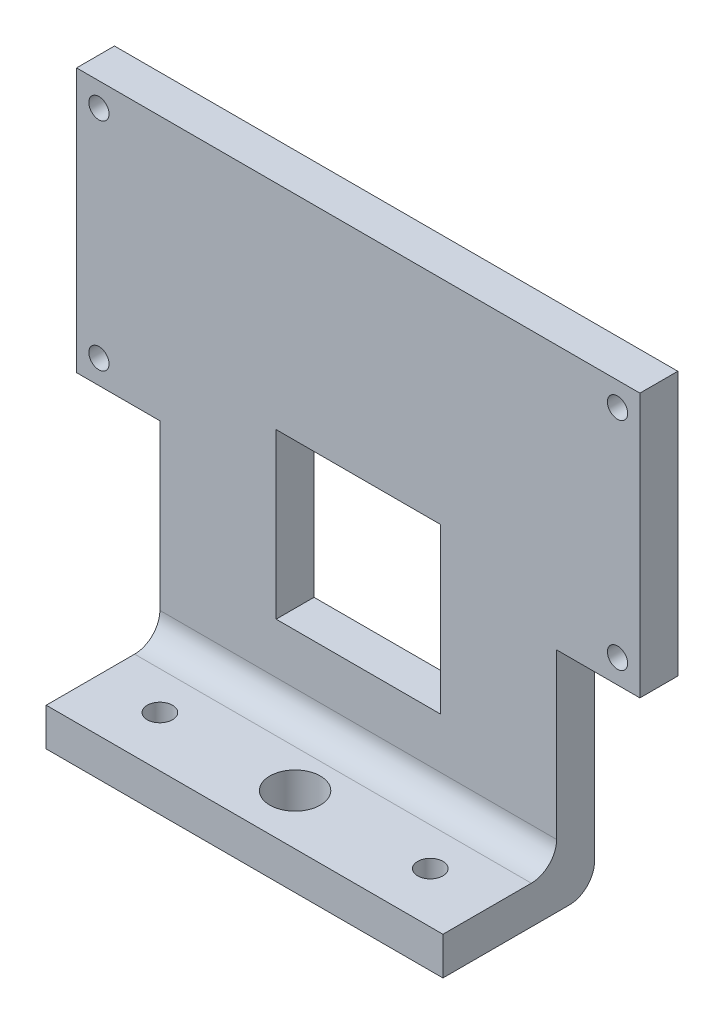
ISO-10303-21;
HEADER;
FILE_DESCRIPTION(('STEP AP214'),'2;1');
FILE_NAME('part.step','',(''),(''),'','','');
FILE_SCHEMA(('AUTOMOTIVE_DESIGN { 1 0 10303 214 1 1 1 1 }'));
ENDSEC;
DATA;
#1=APPLICATION_CONTEXT('core data for automotive mechanical design processes');
#2=APPLICATION_PROTOCOL_DEFINITION('international standard','automotive_design',2000,#1);
#3=PRODUCT_CONTEXT('',#1,'mechanical');
#4=PRODUCT('Part','Part','',(#3));
#5=PRODUCT_RELATED_PRODUCT_CATEGORY('part','',(#4));
#6=PRODUCT_DEFINITION_FORMATION('','',#4);
#7=PRODUCT_DEFINITION_CONTEXT('part definition',#1,'design');
#8=PRODUCT_DEFINITION('design','',#6,#7);
#9=PRODUCT_DEFINITION_SHAPE('','',#8);
#10=(LENGTH_UNIT() NAMED_UNIT(*) SI_UNIT(.MILLI.,.METRE.));
#11=(NAMED_UNIT(*) PLANE_ANGLE_UNIT() SI_UNIT($,.RADIAN.));
#12=(NAMED_UNIT(*) SI_UNIT($,.STERADIAN.) SOLID_ANGLE_UNIT());
#13=UNCERTAINTY_MEASURE_WITH_UNIT(LENGTH_MEASURE(1.E-05),#10,'distance_accuracy_value','');
#14=(GEOMETRIC_REPRESENTATION_CONTEXT(3) GLOBAL_UNCERTAINTY_ASSIGNED_CONTEXT((#13)) GLOBAL_UNIT_ASSIGNED_CONTEXT((#10,
#11,#12)) REPRESENTATION_CONTEXT('',''));
#15=CARTESIAN_POINT('',(0.,0.,0.));
#16=DIRECTION('',(0.,0.,1.));
#17=DIRECTION('',(1.,0.,0.));
#18=AXIS2_PLACEMENT_3D('',#15,#16,#17);
#19=CARTESIAN_POINT('',(0.,3.,1.));
#20=DIRECTION('',(0.,1.,0.));
#21=DIRECTION('',(0.,0.,1.));
#22=AXIS2_PLACEMENT_3D('',#19,#20,#21);
#23=PLANE('',#22);
#24=CARTESIAN_POINT('',(0.,3.,1.));
#25=DIRECTION('',(0.,-1.,0.));
#26=DIRECTION('',(0.,0.,1.));
#27=AXIS2_PLACEMENT_3D('',#24,#25,#26);
#28=CIRCLE('',#27,2.);
#29=CARTESIAN_POINT('',(0.,3.,3.));
#30=VERTEX_POINT('',#29);
#31=EDGE_CURVE('E266',#30,#30,#28,.T.);
#32=ORIENTED_EDGE('',*,*,#31,.T.);
#33=EDGE_LOOP('',(#32));
#34=FACE_BOUND('',#33,.T.);
#35=CARTESIAN_POINT('',(-10.705,3.,1.));
#36=DIRECTION('',(0.,1.,0.));
#37=DIRECTION('',(0.,0.,1.));
#38=AXIS2_PLACEMENT_3D('',#35,#36,#37);
#39=CIRCLE('',#38,1.);
#40=CARTESIAN_POINT('',(-10.705,3.,2.));
#41=VERTEX_POINT('',#40);
#42=EDGE_CURVE('E254',#41,#41,#39,.T.);
#43=ORIENTED_EDGE('',*,*,#42,.F.);
#44=EDGE_LOOP('',(#43));
#45=FACE_BOUND('',#44,.T.);
#46=CARTESIAN_POINT('',(10.705,3.,1.));
#47=DIRECTION('',(0.,-1.,0.));
#48=DIRECTION('',(0.,0.,1.));
#49=AXIS2_PLACEMENT_3D('',#46,#47,#48);
#50=CIRCLE('',#49,1.);
#51=CARTESIAN_POINT('',(10.705,3.,2.));
#52=VERTEX_POINT('',#51);
#53=EDGE_CURVE('E187',#52,#52,#50,.T.);
#54=ORIENTED_EDGE('',*,*,#53,.T.);
#55=EDGE_LOOP('',(#54));
#56=FACE_BOUND('',#55,.T.);
#57=DIRECTION('',(0.,0.,1.));
#58=VECTOR('',#57,1.);
#59=CARTESIAN_POINT('',(15.705,3.,-7.));
#60=LINE('',#59,#58);
#61=CARTESIAN_POINT('',(15.705,3.,-2.));
#62=VERTEX_POINT('',#61);
#63=CARTESIAN_POINT('',(15.705,3.,5.));
#64=VERTEX_POINT('',#63);
#65=EDGE_CURVE('E195',#62,#64,#60,.T.);
#66=ORIENTED_EDGE('',*,*,#65,.F.);
#67=DIRECTION('',(-1.,0.,0.));
#68=VECTOR('',#67,1.);
#69=CARTESIAN_POINT('',(0.,3.,-2.));
#70=LINE('',#69,#68);
#71=CARTESIAN_POINT('',(-15.705,3.,-2.));
#72=VERTEX_POINT('',#71);
#73=EDGE_CURVE('E290',#62,#72,#70,.T.);
#74=ORIENTED_EDGE('',*,*,#73,.T.);
#75=DIRECTION('',(0.,0.,1.));
#76=VECTOR('',#75,1.);
#77=CARTESIAN_POINT('',(-15.705,3.,-7.));
#78=LINE('',#77,#76);
#79=CARTESIAN_POINT('',(-15.705,3.,5.));
#80=VERTEX_POINT('',#79);
#81=EDGE_CURVE('E260',#72,#80,#78,.T.);
#82=ORIENTED_EDGE('',*,*,#81,.T.);
#83=DIRECTION('',(1.,0.,0.));
#84=VECTOR('',#83,1.);
#85=CARTESIAN_POINT('',(0.,3.,5.));
#86=LINE('',#85,#84);
#87=EDGE_CURVE('E262',#80,#64,#86,.T.);
#88=ORIENTED_EDGE('',*,*,#87,.T.);
#89=EDGE_LOOP('',(#66,#74,#82,#88));
#90=FACE_BOUND('',#89,.T.);
#91=ADVANCED_FACE('F37',(#34,#45,#56,#90),#23,.T.);
#92=CARTESIAN_POINT('',(0.,0.,1.));
#93=DIRECTION('',(0.,1.,0.));
#94=DIRECTION('',(0.,0.,1.));
#95=AXIS2_PLACEMENT_3D('',#92,#93,#94);
#96=PLANE('',#95);
#97=CARTESIAN_POINT('',(0.,0.,1.));
#98=DIRECTION('',(0.,-1.,0.));
#99=DIRECTION('',(0.,0.,1.));
#100=AXIS2_PLACEMENT_3D('',#97,#98,#99);
#101=CIRCLE('',#100,2.);
#102=CARTESIAN_POINT('',(0.,0.,3.));
#103=VERTEX_POINT('',#102);
#104=EDGE_CURVE('E263',#103,#103,#101,.T.);
#105=ORIENTED_EDGE('',*,*,#104,.F.);
#106=EDGE_LOOP('',(#105));
#107=FACE_BOUND('',#106,.T.);
#108=DIRECTION('',(0.,0.,1.));
#109=VECTOR('',#108,1.);
#110=CARTESIAN_POINT('',(-15.705,0.,-7.));
#111=LINE('',#110,#109);
#112=CARTESIAN_POINT('',(-15.705,0.,-5.));
#113=VERTEX_POINT('',#112);
#114=CARTESIAN_POINT('',(-15.705,0.,5.));
#115=VERTEX_POINT('',#114);
#116=EDGE_CURVE('E257',#113,#115,#111,.T.);
#117=ORIENTED_EDGE('',*,*,#116,.F.);
#118=DIRECTION('',(-1.,0.,0.));
#119=VECTOR('',#118,1.);
#120=CARTESIAN_POINT('',(0.,0.,-5.));
#121=LINE('',#120,#119);
#122=CARTESIAN_POINT('',(15.705,0.,-5.));
#123=VERTEX_POINT('',#122);
#124=EDGE_CURVE('E286',#113,#123,#121,.F.);
#125=ORIENTED_EDGE('',*,*,#124,.T.);
#126=DIRECTION('',(0.,0.,1.));
#127=VECTOR('',#126,1.);
#128=CARTESIAN_POINT('',(15.705,0.,-7.));
#129=LINE('',#128,#127);
#130=CARTESIAN_POINT('',(15.705,0.,5.));
#131=VERTEX_POINT('',#130);
#132=EDGE_CURVE('E190',#123,#131,#129,.T.);
#133=ORIENTED_EDGE('',*,*,#132,.T.);
#134=DIRECTION('',(1.,0.,0.));
#135=VECTOR('',#134,1.);
#136=CARTESIAN_POINT('',(0.,0.,5.));
#137=LINE('',#136,#135);
#138=EDGE_CURVE('E271',#115,#131,#137,.T.);
#139=ORIENTED_EDGE('',*,*,#138,.F.);
#140=EDGE_LOOP('',(#117,#125,#133,#139));
#141=FACE_BOUND('',#140,.T.);
#142=CARTESIAN_POINT('',(-10.705,0.,1.));
#143=DIRECTION('',(0.,1.,0.));
#144=DIRECTION('',(0.,0.,1.));
#145=AXIS2_PLACEMENT_3D('',#142,#143,#144);
#146=CIRCLE('',#145,1.);
#147=CARTESIAN_POINT('',(-10.705,0.,2.));
#148=VERTEX_POINT('',#147);
#149=EDGE_CURVE('E245',#148,#148,#146,.T.);
#150=ORIENTED_EDGE('',*,*,#149,.T.);
#151=EDGE_LOOP('',(#150));
#152=FACE_BOUND('',#151,.T.);
#153=CARTESIAN_POINT('',(10.705,0.,1.));
#154=DIRECTION('',(0.,-1.,0.));
#155=DIRECTION('',(0.,0.,1.));
#156=AXIS2_PLACEMENT_3D('',#153,#154,#155);
#157=CIRCLE('',#156,1.);
#158=CARTESIAN_POINT('',(10.705,0.,2.));
#159=VERTEX_POINT('',#158);
#160=EDGE_CURVE('E191',#159,#159,#157,.T.);
#161=ORIENTED_EDGE('',*,*,#160,.F.);
#162=EDGE_LOOP('',(#161));
#163=FACE_BOUND('',#162,.T.);
#164=ADVANCED_FACE('F314',(#107,#141,#152,#163),#96,.F.);
#165=CARTESIAN_POINT('',(0.,3.,-7.));
#166=DIRECTION('',(0.,0.,1.));
#167=DIRECTION('',(1.,0.,0.));
#168=AXIS2_PLACEMENT_3D('',#165,#166,#167);
#169=PLANE('',#168);
#170=DIRECTION('',(0.,-1.,0.));
#171=VECTOR('',#170,1.);
#172=CARTESIAN_POINT('',(15.705,3.,-7.));
#173=LINE('',#172,#171);
#174=CARTESIAN_POINT('',(15.705,18.,-7.));
#175=VERTEX_POINT('',#174);
#176=CARTESIAN_POINT('',(15.705,2.,-7.));
#177=VERTEX_POINT('',#176);
#178=EDGE_CURVE('E197',#175,#177,#173,.T.);
#179=ORIENTED_EDGE('',*,*,#178,.T.);
#180=DIRECTION('',(-1.,0.,0.));
#181=VECTOR('',#180,1.);
#182=CARTESIAN_POINT('',(0.,2.,-7.));
#183=LINE('',#182,#181);
#184=CARTESIAN_POINT('',(-15.705,2.,-7.));
#185=VERTEX_POINT('',#184);
#186=EDGE_CURVE('E281',#177,#185,#183,.T.);
#187=ORIENTED_EDGE('',*,*,#186,.T.);
#188=DIRECTION('',(0.,-1.,0.));
#189=VECTOR('',#188,1.);
#190=CARTESIAN_POINT('',(-15.705,3.,-7.));
#191=LINE('',#190,#189);
#192=CARTESIAN_POINT('',(-15.705,18.,-7.));
#193=VERTEX_POINT('',#192);
#194=EDGE_CURVE('E278',#193,#185,#191,.T.);
#195=ORIENTED_EDGE('',*,*,#194,.F.);
#196=DIRECTION('',(-1.,0.,0.));
#197=VECTOR('',#196,1.);
#198=CARTESIAN_POINT('',(-15.705,18.,-7.));
#199=LINE('',#198,#197);
#200=CARTESIAN_POINT('',(-22.3,18.,-6.99999999999999));
#201=VERTEX_POINT('',#200);
#202=EDGE_CURVE('E214',#193,#201,#199,.T.);
#203=ORIENTED_EDGE('',*,*,#202,.T.);
#204=DIRECTION('',(0.,1.,0.));
#205=VECTOR('',#204,1.);
#206=CARTESIAN_POINT('',(-22.3,18.,-6.99999999999999));
#207=LINE('',#206,#205);
#208=CARTESIAN_POINT('',(-22.3,38.9,-6.99999999999999));
#209=VERTEX_POINT('',#208);
#210=EDGE_CURVE('E232',#201,#209,#207,.T.);
#211=ORIENTED_EDGE('',*,*,#210,.T.);
#212=DIRECTION('',(1.,0.,0.));
#213=VECTOR('',#212,1.);
#214=CARTESIAN_POINT('',(-22.3,38.9,-6.99999999999999));
#215=LINE('',#214,#213);
#216=CARTESIAN_POINT('',(22.3,38.9,-6.99999999999999));
#217=VERTEX_POINT('',#216);
#218=EDGE_CURVE('E235',#209,#217,#215,.T.);
#219=ORIENTED_EDGE('',*,*,#218,.T.);
#220=DIRECTION('',(0.,1.,0.));
#221=VECTOR('',#220,1.);
#222=CARTESIAN_POINT('',(22.3,18.,-6.99999999999999));
#223=LINE('',#222,#221);
#224=CARTESIAN_POINT('',(22.3,18.,-6.99999999999999));
#225=VERTEX_POINT('',#224);
#226=EDGE_CURVE('E328',#225,#217,#223,.T.);
#227=ORIENTED_EDGE('',*,*,#226,.F.);
#228=DIRECTION('',(1.,0.,0.));
#229=VECTOR('',#228,1.);
#230=CARTESIAN_POINT('',(15.705,18.,-7.));
#231=LINE('',#230,#229);
#232=EDGE_CURVE('E172',#175,#225,#231,.T.);
#233=ORIENTED_EDGE('',*,*,#232,.F.);
#234=EDGE_LOOP('',(#179,#187,#195,#203,#211,#219,#227,#233));
#235=FACE_BOUND('',#234,.T.);
#236=DIRECTION('',(1.,0.,0.));
#237=VECTOR('',#236,1.);
#238=CARTESIAN_POINT('',(0.,9.,-7.));
#239=LINE('',#238,#237);
#240=CARTESIAN_POINT('',(-6.5,9.,-7.));
#241=VERTEX_POINT('',#240);
#242=CARTESIAN_POINT('',(6.5,9.,-7.));
#243=VERTEX_POINT('',#242);
#244=EDGE_CURVE('E220',#241,#243,#239,.T.);
#245=ORIENTED_EDGE('',*,*,#244,.T.);
#246=DIRECTION('',(0.,-1.,0.));
#247=VECTOR('',#246,1.);
#248=CARTESIAN_POINT('',(6.5,9.,-7.));
#249=LINE('',#248,#247);
#250=CARTESIAN_POINT('',(6.5,22.,-7.));
#251=VERTEX_POINT('',#250);
#252=EDGE_CURVE('E177',#251,#243,#249,.T.);
#253=ORIENTED_EDGE('',*,*,#252,.F.);
#254=DIRECTION('',(-1.,0.,0.));
#255=VECTOR('',#254,1.);
#256=CARTESIAN_POINT('',(-6.5,22.,-7.));
#257=LINE('',#256,#255);
#258=CARTESIAN_POINT('',(-6.5,22.,-7.));
#259=VERTEX_POINT('',#258);
#260=EDGE_CURVE('E237',#251,#259,#257,.T.);
#261=ORIENTED_EDGE('',*,*,#260,.T.);
#262=DIRECTION('',(0.,-1.,0.));
#263=VECTOR('',#262,1.);
#264=CARTESIAN_POINT('',(-6.5,9.,-7.));
#265=LINE('',#264,#263);
#266=EDGE_CURVE('E240',#259,#241,#265,.T.);
#267=ORIENTED_EDGE('',*,*,#266,.T.);
#268=EDGE_LOOP('',(#245,#253,#261,#267));
#269=FACE_BOUND('',#268,.T.);
#270=CARTESIAN_POINT('',(-20.53,37.02,-7.));
#271=DIRECTION('',(0.,0.,-1.));
#272=DIRECTION('',(1.,0.,0.));
#273=AXIS2_PLACEMENT_3D('',#270,#271,#272);
#274=CIRCLE('',#273,0.8);
#275=CARTESIAN_POINT('',(-19.73,37.02,-7.));
#276=VERTEX_POINT('',#275);
#277=EDGE_CURVE('E204',#276,#276,#274,.T.);
#278=ORIENTED_EDGE('',*,*,#277,.F.);
#279=EDGE_LOOP('',(#278));
#280=FACE_BOUND('',#279,.T.);
#281=CARTESIAN_POINT('',(-20.53,19.88,-7.));
#282=DIRECTION('',(0.,0.,-1.));
#283=DIRECTION('',(-1.,0.,0.));
#284=AXIS2_PLACEMENT_3D('',#281,#282,#283);
#285=CIRCLE('',#284,0.799999999999999);
#286=CARTESIAN_POINT('',(-21.33,19.88,-7.));
#287=VERTEX_POINT('',#286);
#288=EDGE_CURVE('E208',#287,#287,#285,.T.);
#289=ORIENTED_EDGE('',*,*,#288,.F.);
#290=EDGE_LOOP('',(#289));
#291=FACE_BOUND('',#290,.T.);
#292=CARTESIAN_POINT('',(20.53,19.88,-7.));
#293=DIRECTION('',(0.,0.,1.));
#294=DIRECTION('',(1.,0.,0.));
#295=AXIS2_PLACEMENT_3D('',#292,#293,#294);
#296=CIRCLE('',#295,0.799999999999999);
#297=CARTESIAN_POINT('',(21.33,19.88,-7.));
#298=VERTEX_POINT('',#297);
#299=EDGE_CURVE('E354',#298,#298,#296,.T.);
#300=ORIENTED_EDGE('',*,*,#299,.T.);
#301=EDGE_LOOP('',(#300));
#302=FACE_BOUND('',#301,.T.);
#303=CARTESIAN_POINT('',(20.53,37.02,-7.));
#304=DIRECTION('',(0.,0.,1.));
#305=DIRECTION('',(-1.,0.,0.));
#306=AXIS2_PLACEMENT_3D('',#303,#304,#305);
#307=CIRCLE('',#306,0.8);
#308=CARTESIAN_POINT('',(19.73,37.02,-7.));
#309=VERTEX_POINT('',#308);
#310=EDGE_CURVE('E362',#309,#309,#307,.T.);
#311=ORIENTED_EDGE('',*,*,#310,.T.);
#312=EDGE_LOOP('',(#311));
#313=FACE_BOUND('',#312,.T.);
#314=ADVANCED_FACE('F324',(#235,#269,#280,#291,#302,#313),#169,.F.);
#315=CARTESIAN_POINT('',(-15.705,3.,-7.));
#316=DIRECTION('',(1.,0.,0.));
#317=DIRECTION('',(0.,0.,-1.));
#318=AXIS2_PLACEMENT_3D('',#315,#316,#317);
#319=PLANE('',#318);
#320=ORIENTED_EDGE('',*,*,#194,.T.);
#321=CARTESIAN_POINT('',(-15.705,2.,-5.));
#322=DIRECTION('',(1.,0.,0.));
#323=DIRECTION('',(0.,0.,-1.));
#324=AXIS2_PLACEMENT_3D('',#321,#322,#323);
#325=CIRCLE('',#324,2.);
#326=EDGE_CURVE('E284',#185,#113,#325,.F.);
#327=ORIENTED_EDGE('',*,*,#326,.T.);
#328=ORIENTED_EDGE('',*,*,#116,.T.);
#329=DIRECTION('',(0.,-1.,0.));
#330=VECTOR('',#329,1.);
#331=CARTESIAN_POINT('',(-15.705,3.,5.));
#332=LINE('',#331,#330);
#333=EDGE_CURVE('E269',#80,#115,#332,.T.);
#334=ORIENTED_EDGE('',*,*,#333,.F.);
#335=ORIENTED_EDGE('',*,*,#81,.F.);
#336=CARTESIAN_POINT('',(-15.705,5.,-2.));
#337=DIRECTION('',(1.,0.,0.));
#338=DIRECTION('',(0.,0.,-1.));
#339=AXIS2_PLACEMENT_3D('',#336,#337,#338);
#340=CIRCLE('',#339,2.);
#341=CARTESIAN_POINT('',(-15.705,5.,-4.));
#342=VERTEX_POINT('',#341);
#343=EDGE_CURVE('E45',#72,#342,#340,.T.);
#344=ORIENTED_EDGE('',*,*,#343,.T.);
#345=DIRECTION('',(0.,1.,0.));
#346=VECTOR('',#345,1.);
#347=CARTESIAN_POINT('',(-15.705,3.,-4.));
#348=LINE('',#347,#346);
#349=CARTESIAN_POINT('',(-15.705,18.,-4.));
#350=VERTEX_POINT('',#349);
#351=EDGE_CURVE('E217',#342,#350,#348,.T.);
#352=ORIENTED_EDGE('',*,*,#351,.T.);
#353=DIRECTION('',(0.,0.,-1.));
#354=VECTOR('',#353,1.);
#355=CARTESIAN_POINT('',(-15.705,18.,-4.));
#356=LINE('',#355,#354);
#357=EDGE_CURVE('E159',#350,#193,#356,.T.);
#358=ORIENTED_EDGE('',*,*,#357,.T.);
#359=EDGE_LOOP('',(#320,#327,#328,#334,#335,#344,#352,#358));
#360=FACE_BOUND('',#359,.T.);
#361=ADVANCED_FACE('F295',(#360),#319,.F.);
#362=CARTESIAN_POINT('',(0.,3.,5.));
#363=DIRECTION('',(0.,0.,-1.));
#364=DIRECTION('',(-1.,0.,0.));
#365=AXIS2_PLACEMENT_3D('',#362,#363,#364);
#366=PLANE('',#365);
#367=ORIENTED_EDGE('',*,*,#138,.T.);
#368=DIRECTION('',(0.,-1.,0.));
#369=VECTOR('',#368,1.);
#370=CARTESIAN_POINT('',(15.705,3.,5.));
#371=LINE('',#370,#369);
#372=EDGE_CURVE('E201',#64,#131,#371,.T.);
#373=ORIENTED_EDGE('',*,*,#372,.F.);
#374=ORIENTED_EDGE('',*,*,#87,.F.);
#375=ORIENTED_EDGE('',*,*,#333,.T.);
#376=EDGE_LOOP('',(#367,#373,#374,#375));
#377=FACE_BOUND('',#376,.T.);
#378=ADVANCED_FACE('F310',(#377),#366,.F.);
#379=CARTESIAN_POINT('',(0.,3.,1.));
#380=DIRECTION('',(0.,-1.,0.));
#381=DIRECTION('',(0.,0.,-1.));
#382=AXIS2_PLACEMENT_3D('',#379,#380,#381);
#383=CYLINDRICAL_SURFACE('',#382,2.);
#384=ORIENTED_EDGE('',*,*,#104,.T.);
#385=EDGE_LOOP('',(#384));
#386=FACE_BOUND('',#385,.T.);
#387=ORIENTED_EDGE('',*,*,#31,.F.);
#388=EDGE_LOOP('',(#387));
#389=FACE_BOUND('',#388,.T.);
#390=ADVANCED_FACE('F398',(#386,#389),#383,.F.);
#391=CARTESIAN_POINT('',(-10.705,3.,1.));
#392=DIRECTION('',(0.,-1.,0.));
#393=DIRECTION('',(0.,0.,-1.));
#394=AXIS2_PLACEMENT_3D('',#391,#392,#393);
#395=CYLINDRICAL_SURFACE('',#394,1.);
#396=ORIENTED_EDGE('',*,*,#42,.T.);
#397=EDGE_LOOP('',(#396));
#398=FACE_BOUND('',#397,.T.);
#399=ORIENTED_EDGE('',*,*,#149,.F.);
#400=EDGE_LOOP('',(#399));
#401=FACE_BOUND('',#400,.T.);
#402=ADVANCED_FACE('F396',(#398,#401),#395,.F.);
#403=CARTESIAN_POINT('',(0.,9.,-4.));
#404=DIRECTION('',(0.,1.,0.));
#405=DIRECTION('',(0.,0.,1.));
#406=AXIS2_PLACEMENT_3D('',#403,#404,#405);
#407=PLANE('',#406);
#408=ORIENTED_EDGE('',*,*,#244,.F.);
#409=DIRECTION('',(0.,0.,-1.));
#410=VECTOR('',#409,1.);
#411=CARTESIAN_POINT('',(-6.5,9.,-4.));
#412=LINE('',#411,#410);
#413=CARTESIAN_POINT('',(-6.5,9.,-4.));
#414=VERTEX_POINT('',#413);
#415=EDGE_CURVE('E155',#414,#241,#412,.T.);
#416=ORIENTED_EDGE('',*,*,#415,.F.);
#417=DIRECTION('',(1.,0.,0.));
#418=VECTOR('',#417,1.);
#419=CARTESIAN_POINT('',(0.,9.,-4.));
#420=LINE('',#419,#418);
#421=CARTESIAN_POINT('',(6.5,9.,-4.));
#422=VERTEX_POINT('',#421);
#423=EDGE_CURVE('E149',#414,#422,#420,.T.);
#424=ORIENTED_EDGE('',*,*,#423,.T.);
#425=DIRECTION('',(0.,0.,-1.));
#426=VECTOR('',#425,1.);
#427=CARTESIAN_POINT('',(6.5,9.,-4.));
#428=LINE('',#427,#426);
#429=EDGE_CURVE('E154',#422,#243,#428,.T.);
#430=ORIENTED_EDGE('',*,*,#429,.T.);
#431=EDGE_LOOP('',(#408,#416,#424,#430));
#432=FACE_BOUND('',#431,.T.);
#433=ADVANCED_FACE('F152',(#432),#407,.T.);
#434=CARTESIAN_POINT('',(-6.5,9.,-4.));
#435=DIRECTION('',(1.,0.,0.));
#436=DIRECTION('',(0.,0.,-1.));
#437=AXIS2_PLACEMENT_3D('',#434,#435,#436);
#438=PLANE('',#437);
#439=ORIENTED_EDGE('',*,*,#266,.F.);
#440=DIRECTION('',(0.,0.,-1.));
#441=VECTOR('',#440,1.);
#442=CARTESIAN_POINT('',(-6.5,22.,-4.));
#443=LINE('',#442,#441);
#444=CARTESIAN_POINT('',(-6.5,22.,-4.));
#445=VERTEX_POINT('',#444);
#446=EDGE_CURVE('E246',#445,#259,#443,.T.);
#447=ORIENTED_EDGE('',*,*,#446,.F.);
#448=DIRECTION('',(0.,-1.,0.));
#449=VECTOR('',#448,1.);
#450=CARTESIAN_POINT('',(-6.5,9.,-4.));
#451=LINE('',#450,#449);
#452=EDGE_CURVE('E160',#445,#414,#451,.T.);
#453=ORIENTED_EDGE('',*,*,#452,.T.);
#454=ORIENTED_EDGE('',*,*,#415,.T.);
#455=EDGE_LOOP('',(#439,#447,#453,#454));
#456=FACE_BOUND('',#455,.T.);
#457=ADVANCED_FACE('F577',(#456),#438,.T.);
#458=CARTESIAN_POINT('',(-6.5,22.,-4.));
#459=DIRECTION('',(0.,-1.,0.));
#460=DIRECTION('',(0.,0.,-1.));
#461=AXIS2_PLACEMENT_3D('',#458,#459,#460);
#462=PLANE('',#461);
#463=ORIENTED_EDGE('',*,*,#260,.F.);
#464=DIRECTION('',(0.,0.,-1.));
#465=VECTOR('',#464,1.);
#466=CARTESIAN_POINT('',(6.5,22.,-4.));
#467=LINE('',#466,#465);
#468=CARTESIAN_POINT('',(6.5,22.,-4.));
#469=VERTEX_POINT('',#468);
#470=EDGE_CURVE('E178',#469,#251,#467,.T.);
#471=ORIENTED_EDGE('',*,*,#470,.F.);
#472=DIRECTION('',(-1.,0.,0.));
#473=VECTOR('',#472,1.);
#474=CARTESIAN_POINT('',(-6.5,22.,-4.));
#475=LINE('',#474,#473);
#476=EDGE_CURVE('E167',#469,#445,#475,.T.);
#477=ORIENTED_EDGE('',*,*,#476,.T.);
#478=ORIENTED_EDGE('',*,*,#446,.T.);
#479=EDGE_LOOP('',(#463,#471,#477,#478));
#480=FACE_BOUND('',#479,.T.);
#481=ADVANCED_FACE('F582',(#480),#462,.T.);
#482=CARTESIAN_POINT('',(-22.3,38.9,-3.99999999999999));
#483=DIRECTION('',(0.,1.,0.));
#484=DIRECTION('',(0.,0.,1.));
#485=AXIS2_PLACEMENT_3D('',#482,#483,#484);
#486=PLANE('',#485);
#487=ORIENTED_EDGE('',*,*,#218,.F.);
#488=DIRECTION('',(0.,0.,-1.));
#489=VECTOR('',#488,1.);
#490=CARTESIAN_POINT('',(-22.3,38.9,-3.99999999999999));
#491=LINE('',#490,#489);
#492=CARTESIAN_POINT('',(-22.3,38.9,-3.99999999999999));
#493=VERTEX_POINT('',#492);
#494=EDGE_CURVE('E248',#493,#209,#491,.T.);
#495=ORIENTED_EDGE('',*,*,#494,.F.);
#496=DIRECTION('',(1.,0.,0.));
#497=VECTOR('',#496,1.);
#498=CARTESIAN_POINT('',(-22.3,38.9,-3.99999999999999));
#499=LINE('',#498,#497);
#500=CARTESIAN_POINT('',(22.3,38.9,-3.99999999999999));
#501=VERTEX_POINT('',#500);
#502=EDGE_CURVE('E226',#493,#501,#499,.T.);
#503=ORIENTED_EDGE('',*,*,#502,.T.);
#504=DIRECTION('',(0.,0.,-1.));
#505=VECTOR('',#504,1.);
#506=CARTESIAN_POINT('',(22.3,38.9,-3.99999999999999));
#507=LINE('',#506,#505);
#508=EDGE_CURVE('E181',#501,#217,#507,.T.);
#509=ORIENTED_EDGE('',*,*,#508,.T.);
#510=EDGE_LOOP('',(#487,#495,#503,#509));
#511=FACE_BOUND('',#510,.T.);
#512=ADVANCED_FACE('F342',(#511),#486,.T.);
#513=CARTESIAN_POINT('',(-22.3,18.,-3.99999999999999));
#514=DIRECTION('',(-1.,0.,0.));
#515=DIRECTION('',(0.,0.,1.));
#516=AXIS2_PLACEMENT_3D('',#513,#514,#515);
#517=PLANE('',#516);
#518=ORIENTED_EDGE('',*,*,#210,.F.);
#519=DIRECTION('',(0.,0.,-1.));
#520=VECTOR('',#519,1.);
#521=CARTESIAN_POINT('',(-22.3,18.,-3.99999999999999));
#522=LINE('',#521,#520);
#523=CARTESIAN_POINT('',(-22.3,18.,-3.99999999999999));
#524=VERTEX_POINT('',#523);
#525=EDGE_CURVE('E250',#524,#201,#522,.T.);
#526=ORIENTED_EDGE('',*,*,#525,.F.);
#527=DIRECTION('',(0.,1.,0.));
#528=VECTOR('',#527,1.);
#529=CARTESIAN_POINT('',(-22.3,18.,-3.99999999999999));
#530=LINE('',#529,#528);
#531=EDGE_CURVE('E223',#524,#493,#530,.T.);
#532=ORIENTED_EDGE('',*,*,#531,.T.);
#533=ORIENTED_EDGE('',*,*,#494,.T.);
#534=EDGE_LOOP('',(#518,#526,#532,#533));
#535=FACE_BOUND('',#534,.T.);
#536=ADVANCED_FACE('F382',(#535),#517,.T.);
#537=CARTESIAN_POINT('',(-15.705,18.,-4.));
#538=DIRECTION('',(0.,-1.,0.));
#539=DIRECTION('',(0.,0.,-1.));
#540=AXIS2_PLACEMENT_3D('',#537,#538,#539);
#541=PLANE('',#540);
#542=ORIENTED_EDGE('',*,*,#202,.F.);
#543=ORIENTED_EDGE('',*,*,#357,.F.);
#544=DIRECTION('',(-1.,0.,0.));
#545=VECTOR('',#544,1.);
#546=CARTESIAN_POINT('',(-15.705,18.,-4.));
#547=LINE('',#546,#545);
#548=EDGE_CURVE('E219',#350,#524,#547,.T.);
#549=ORIENTED_EDGE('',*,*,#548,.T.);
#550=ORIENTED_EDGE('',*,*,#525,.T.);
#551=EDGE_LOOP('',(#542,#543,#549,#550));
#552=FACE_BOUND('',#551,.T.);
#553=ADVANCED_FACE('F373',(#552),#541,.T.);
#554=CARTESIAN_POINT('',(0.,0.,-4.));
#555=DIRECTION('',(0.,0.,-1.));
#556=DIRECTION('',(-1.,0.,0.));
#557=AXIS2_PLACEMENT_3D('',#554,#555,#556);
#558=PLANE('',#557);
#559=ORIENTED_EDGE('',*,*,#476,.F.);
#560=DIRECTION('',(0.,-1.,0.));
#561=VECTOR('',#560,1.);
#562=CARTESIAN_POINT('',(6.5,9.,-4.));
#563=LINE('',#562,#561);
#564=EDGE_CURVE('E163',#469,#422,#563,.T.);
#565=ORIENTED_EDGE('',*,*,#564,.T.);
#566=ORIENTED_EDGE('',*,*,#423,.F.);
#567=ORIENTED_EDGE('',*,*,#452,.F.);
#568=EDGE_LOOP('',(#559,#565,#566,#567));
#569=FACE_BOUND('',#568,.T.);
#570=CARTESIAN_POINT('',(-20.53,37.02,-4.));
#571=DIRECTION('',(0.,0.,-1.));
#572=DIRECTION('',(1.,0.,0.));
#573=AXIS2_PLACEMENT_3D('',#570,#571,#572);
#574=CIRCLE('',#573,0.8);
#575=CARTESIAN_POINT('',(-19.73,37.02,-4.));
#576=VERTEX_POINT('',#575);
#577=EDGE_CURVE('E205',#576,#576,#574,.T.);
#578=ORIENTED_EDGE('',*,*,#577,.T.);
#579=EDGE_LOOP('',(#578));
#580=FACE_BOUND('',#579,.T.);
#581=CARTESIAN_POINT('',(-20.53,19.88,-4.));
#582=DIRECTION('',(0.,0.,-1.));
#583=DIRECTION('',(-1.,0.,0.));
#584=AXIS2_PLACEMENT_3D('',#581,#582,#583);
#585=CIRCLE('',#584,0.799999999999999);
#586=CARTESIAN_POINT('',(-21.33,19.88,-4.));
#587=VERTEX_POINT('',#586);
#588=EDGE_CURVE('E211',#587,#587,#585,.T.);
#589=ORIENTED_EDGE('',*,*,#588,.T.);
#590=EDGE_LOOP('',(#589));
#591=FACE_BOUND('',#590,.T.);
#592=ORIENTED_EDGE('',*,*,#351,.F.);
#593=DIRECTION('',(-1.,0.,0.));
#594=VECTOR('',#593,1.);
#595=CARTESIAN_POINT('',(0.,5.,-4.));
#596=LINE('',#595,#594);
#597=CARTESIAN_POINT('',(15.705,5.,-4.));
#598=VERTEX_POINT('',#597);
#599=EDGE_CURVE('E58',#342,#598,#596,.F.);
#600=ORIENTED_EDGE('',*,*,#599,.T.);
#601=DIRECTION('',(0.,1.,0.));
#602=VECTOR('',#601,1.);
#603=CARTESIAN_POINT('',(15.705,3.,-4.));
#604=LINE('',#603,#602);
#605=CARTESIAN_POINT('',(15.705,18.,-4.));
#606=VERTEX_POINT('',#605);
#607=EDGE_CURVE('E179',#598,#606,#604,.T.);
#608=ORIENTED_EDGE('',*,*,#607,.T.);
#609=DIRECTION('',(1.,0.,0.));
#610=VECTOR('',#609,1.);
#611=CARTESIAN_POINT('',(15.705,18.,-4.));
#612=LINE('',#611,#610);
#613=CARTESIAN_POINT('',(22.3,18.,-3.99999999999999));
#614=VERTEX_POINT('',#613);
#615=EDGE_CURVE('E183',#606,#614,#612,.T.);
#616=ORIENTED_EDGE('',*,*,#615,.T.);
#617=DIRECTION('',(0.,1.,0.));
#618=VECTOR('',#617,1.);
#619=CARTESIAN_POINT('',(22.3,18.,-3.99999999999999));
#620=LINE('',#619,#618);
#621=EDGE_CURVE('E171',#614,#501,#620,.T.);
#622=ORIENTED_EDGE('',*,*,#621,.T.);
#623=ORIENTED_EDGE('',*,*,#502,.F.);
#624=ORIENTED_EDGE('',*,*,#531,.F.);
#625=ORIENTED_EDGE('',*,*,#548,.F.);
#626=EDGE_LOOP('',(#592,#600,#608,#616,#622,#623,#624,#625));
#627=FACE_BOUND('',#626,.T.);
#628=CARTESIAN_POINT('',(20.53,19.88,-4.));
#629=DIRECTION('',(0.,0.,1.));
#630=DIRECTION('',(1.,0.,0.));
#631=AXIS2_PLACEMENT_3D('',#628,#629,#630);
#632=CIRCLE('',#631,0.799999999999999);
#633=CARTESIAN_POINT('',(21.33,19.88,-4.));
#634=VERTEX_POINT('',#633);
#635=EDGE_CURVE('E352',#634,#634,#632,.T.);
#636=ORIENTED_EDGE('',*,*,#635,.F.);
#637=EDGE_LOOP('',(#636));
#638=FACE_BOUND('',#637,.T.);
#639=CARTESIAN_POINT('',(20.53,37.02,-4.));
#640=DIRECTION('',(0.,0.,1.));
#641=DIRECTION('',(-1.,0.,0.));
#642=AXIS2_PLACEMENT_3D('',#639,#640,#641);
#643=CIRCLE('',#642,0.8);
#644=CARTESIAN_POINT('',(19.73,37.02,-4.));
#645=VERTEX_POINT('',#644);
#646=EDGE_CURVE('E359',#645,#645,#643,.T.);
#647=ORIENTED_EDGE('',*,*,#646,.F.);
#648=EDGE_LOOP('',(#647));
#649=FACE_BOUND('',#648,.T.);
#650=ADVANCED_FACE('F164',(#569,#580,#591,#627,#638,#649),#558,.F.);
#651=CARTESIAN_POINT('',(-20.53,19.88,-4.));
#652=DIRECTION('',(0.,0.,-1.));
#653=DIRECTION('',(-1.,0.,0.));
#654=AXIS2_PLACEMENT_3D('',#651,#652,#653);
#655=CYLINDRICAL_SURFACE('',#654,0.799999999999999);
#656=ORIENTED_EDGE('',*,*,#588,.F.);
#657=EDGE_LOOP('',(#656));
#658=FACE_BOUND('',#657,.T.);
#659=ORIENTED_EDGE('',*,*,#288,.T.);
#660=EDGE_LOOP('',(#659));
#661=FACE_BOUND('',#660,.T.);
#662=ADVANCED_FACE('F372',(#658,#661),#655,.F.);
#663=CARTESIAN_POINT('',(-20.53,37.02,-4.));
#664=DIRECTION('',(0.,0.,-1.));
#665=DIRECTION('',(-1.,0.,0.));
#666=AXIS2_PLACEMENT_3D('',#663,#664,#665);
#667=CYLINDRICAL_SURFACE('',#666,0.8);
#668=ORIENTED_EDGE('',*,*,#577,.F.);
#669=EDGE_LOOP('',(#668));
#670=FACE_BOUND('',#669,.T.);
#671=ORIENTED_EDGE('',*,*,#277,.T.);
#672=EDGE_LOOP('',(#671));
#673=FACE_BOUND('',#672,.T.);
#674=ADVANCED_FACE('F379',(#670,#673),#667,.F.);
#675=CARTESIAN_POINT('',(15.705,3.,-7.));
#676=DIRECTION('',(1.,0.,0.));
#677=DIRECTION('',(0.,0.,-1.));
#678=AXIS2_PLACEMENT_3D('',#675,#676,#677);
#679=PLANE('',#678);
#680=ORIENTED_EDGE('',*,*,#132,.F.);
#681=CARTESIAN_POINT('',(15.705,2.,-5.));
#682=DIRECTION('',(1.,0.,0.));
#683=DIRECTION('',(0.,0.,-1.));
#684=AXIS2_PLACEMENT_3D('',#681,#682,#683);
#685=CIRCLE('',#684,2.);
#686=EDGE_CURVE('E288',#123,#177,#685,.T.);
#687=ORIENTED_EDGE('',*,*,#686,.T.);
#688=ORIENTED_EDGE('',*,*,#178,.F.);
#689=DIRECTION('',(0.,0.,-1.));
#690=VECTOR('',#689,1.);
#691=CARTESIAN_POINT('',(15.705,18.,-4.));
#692=LINE('',#691,#690);
#693=EDGE_CURVE('E194',#606,#175,#692,.T.);
#694=ORIENTED_EDGE('',*,*,#693,.F.);
#695=ORIENTED_EDGE('',*,*,#607,.F.);
#696=CARTESIAN_POINT('',(15.705,5.,-2.));
#697=DIRECTION('',(1.,0.,0.));
#698=DIRECTION('',(0.,0.,-1.));
#699=AXIS2_PLACEMENT_3D('',#696,#697,#698);
#700=CIRCLE('',#699,2.);
#701=EDGE_CURVE('E11',#598,#62,#700,.F.);
#702=ORIENTED_EDGE('',*,*,#701,.T.);
#703=ORIENTED_EDGE('',*,*,#65,.T.);
#704=ORIENTED_EDGE('',*,*,#372,.T.);
#705=EDGE_LOOP('',(#680,#687,#688,#694,#695,#702,#703,#704));
#706=FACE_BOUND('',#705,.T.);
#707=ADVANCED_FACE('F307',(#706),#679,.T.);
#708=CARTESIAN_POINT('',(10.705,3.,1.));
#709=DIRECTION('',(0.,-1.,0.));
#710=DIRECTION('',(0.,0.,-1.));
#711=AXIS2_PLACEMENT_3D('',#708,#709,#710);
#712=CYLINDRICAL_SURFACE('',#711,1.);
#713=ORIENTED_EDGE('',*,*,#53,.F.);
#714=EDGE_LOOP('',(#713));
#715=FACE_BOUND('',#714,.T.);
#716=ORIENTED_EDGE('',*,*,#160,.T.);
#717=EDGE_LOOP('',(#716));
#718=FACE_BOUND('',#717,.T.);
#719=ADVANCED_FACE('F421',(#715,#718),#712,.F.);
#720=CARTESIAN_POINT('',(15.705,18.,-4.));
#721=DIRECTION('',(0.,1.,0.));
#722=DIRECTION('',(0.,0.,1.));
#723=AXIS2_PLACEMENT_3D('',#720,#721,#722);
#724=PLANE('',#723);
#725=ORIENTED_EDGE('',*,*,#232,.T.);
#726=DIRECTION('',(0.,0.,-1.));
#727=VECTOR('',#726,1.);
#728=CARTESIAN_POINT('',(22.3,18.,-3.99999999999999));
#729=LINE('',#728,#727);
#730=EDGE_CURVE('E337',#614,#225,#729,.T.);
#731=ORIENTED_EDGE('',*,*,#730,.F.);
#732=ORIENTED_EDGE('',*,*,#615,.F.);
#733=ORIENTED_EDGE('',*,*,#693,.T.);
#734=EDGE_LOOP('',(#725,#731,#732,#733));
#735=FACE_BOUND('',#734,.T.);
#736=ADVANCED_FACE('F349',(#735),#724,.F.);
#737=CARTESIAN_POINT('',(22.3,18.,-3.99999999999999));
#738=DIRECTION('',(-1.,0.,0.));
#739=DIRECTION('',(0.,0.,1.));
#740=AXIS2_PLACEMENT_3D('',#737,#738,#739);
#741=PLANE('',#740);
#742=ORIENTED_EDGE('',*,*,#226,.T.);
#743=ORIENTED_EDGE('',*,*,#508,.F.);
#744=ORIENTED_EDGE('',*,*,#621,.F.);
#745=ORIENTED_EDGE('',*,*,#730,.T.);
#746=EDGE_LOOP('',(#742,#743,#744,#745));
#747=FACE_BOUND('',#746,.T.);
#748=ADVANCED_FACE('F347',(#747),#741,.F.);
#749=CARTESIAN_POINT('',(6.5,9.,-4.));
#750=DIRECTION('',(1.,0.,0.));
#751=DIRECTION('',(0.,0.,-1.));
#752=AXIS2_PLACEMENT_3D('',#749,#750,#751);
#753=PLANE('',#752);
#754=ORIENTED_EDGE('',*,*,#252,.T.);
#755=ORIENTED_EDGE('',*,*,#429,.F.);
#756=ORIENTED_EDGE('',*,*,#564,.F.);
#757=ORIENTED_EDGE('',*,*,#470,.T.);
#758=EDGE_LOOP('',(#754,#755,#756,#757));
#759=FACE_BOUND('',#758,.T.);
#760=ADVANCED_FACE('F175',(#759),#753,.F.);
#761=CARTESIAN_POINT('',(20.53,19.88,-4.));
#762=DIRECTION('',(0.,0.,-1.));
#763=DIRECTION('',(-1.,0.,0.));
#764=AXIS2_PLACEMENT_3D('',#761,#762,#763);
#765=CYLINDRICAL_SURFACE('',#764,0.799999999999999);
#766=ORIENTED_EDGE('',*,*,#635,.T.);
#767=EDGE_LOOP('',(#766));
#768=FACE_BOUND('',#767,.T.);
#769=ORIENTED_EDGE('',*,*,#299,.F.);
#770=EDGE_LOOP('',(#769));
#771=FACE_BOUND('',#770,.T.);
#772=ADVANCED_FACE('F412',(#768,#771),#765,.F.);
#773=CARTESIAN_POINT('',(20.53,37.02,-4.));
#774=DIRECTION('',(0.,0.,-1.));
#775=DIRECTION('',(-1.,0.,0.));
#776=AXIS2_PLACEMENT_3D('',#773,#774,#775);
#777=CYLINDRICAL_SURFACE('',#776,0.8);
#778=ORIENTED_EDGE('',*,*,#646,.T.);
#779=EDGE_LOOP('',(#778));
#780=FACE_BOUND('',#779,.T.);
#781=ORIENTED_EDGE('',*,*,#310,.F.);
#782=EDGE_LOOP('',(#781));
#783=FACE_BOUND('',#782,.T.);
#784=ADVANCED_FACE('F368',(#780,#783),#777,.F.);
#785=CARTESIAN_POINT('',(0.,2.,-5.));
#786=DIRECTION('',(-1.,0.,0.));
#787=DIRECTION('',(0.,0.,1.));
#788=AXIS2_PLACEMENT_3D('',#785,#786,#787);
#789=CYLINDRICAL_SURFACE('',#788,2.);
#790=ORIENTED_EDGE('',*,*,#686,.F.);
#791=ORIENTED_EDGE('',*,*,#124,.F.);
#792=ORIENTED_EDGE('',*,*,#326,.F.);
#793=ORIENTED_EDGE('',*,*,#186,.F.);
#794=EDGE_LOOP('',(#790,#791,#792,#793));
#795=FACE_BOUND('',#794,.T.);
#796=ADVANCED_FACE('F318',(#795),#789,.T.);
#797=CARTESIAN_POINT('',(0.,5.,-2.));
#798=DIRECTION('',(-1.,0.,0.));
#799=DIRECTION('',(0.,0.,1.));
#800=AXIS2_PLACEMENT_3D('',#797,#798,#799);
#801=CYLINDRICAL_SURFACE('',#800,2.);
#802=ORIENTED_EDGE('',*,*,#701,.F.);
#803=ORIENTED_EDGE('',*,*,#599,.F.);
#804=ORIENTED_EDGE('',*,*,#343,.F.);
#805=ORIENTED_EDGE('',*,*,#73,.F.);
#806=EDGE_LOOP('',(#802,#803,#804,#805));
#807=FACE_BOUND('',#806,.T.);
#808=ADVANCED_FACE('F39',(#807),#801,.F.);
#809=CLOSED_SHELL('',(#91,#164,#314,#361,#378,#390,#402,#433,#457,#481,#512,#536,#553,#650,#662,
#674,#707,#719,#736,#748,#760,#772,#784,#796,#808));
#810=MANIFOLD_SOLID_BREP('B2',#809);
#811=ADVANCED_BREP_SHAPE_REPRESENTATION('',(#18,#810),#14);
#812=SHAPE_DEFINITION_REPRESENTATION(#9,#811);
ENDSEC;
END-ISO-10303-21;
